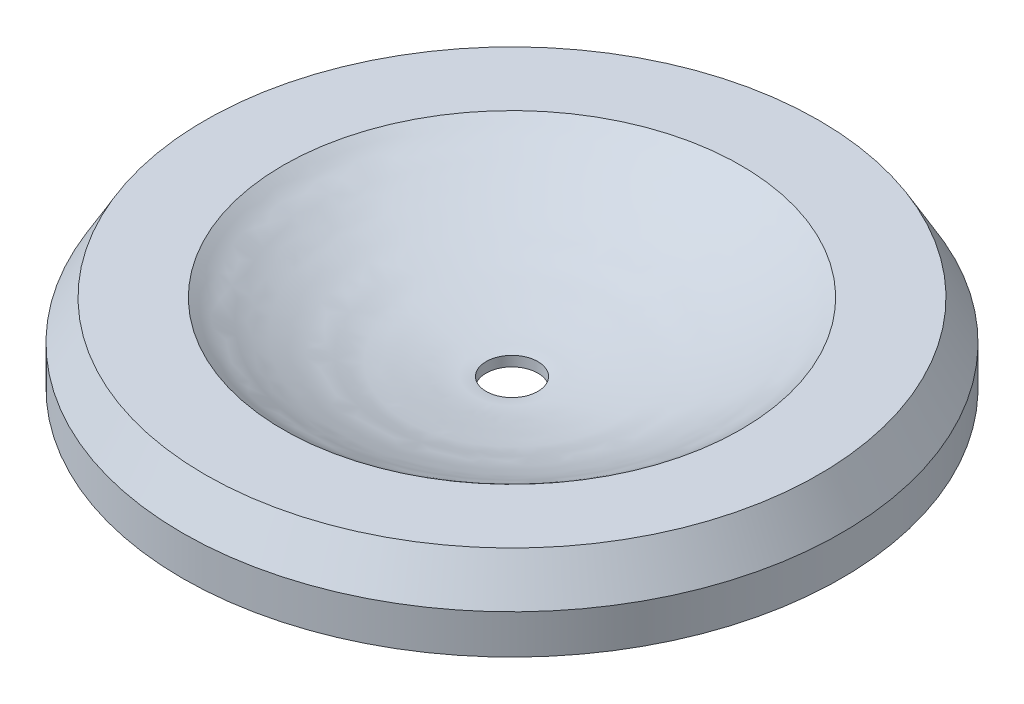
ISO-10303-21;
HEADER;
FILE_DESCRIPTION(('STEP AP214'),'2;1');
FILE_NAME('part.step','',(''),(''),'','','');
FILE_SCHEMA(('AUTOMOTIVE_DESIGN { 1 0 10303 214 1 1 1 1 }'));
ENDSEC;
DATA;
#1=APPLICATION_CONTEXT('core data for automotive mechanical design processes');
#2=APPLICATION_PROTOCOL_DEFINITION('international standard','automotive_design',2000,#1);
#3=PRODUCT_CONTEXT('',#1,'mechanical');
#4=PRODUCT('Part','Part','',(#3));
#5=PRODUCT_RELATED_PRODUCT_CATEGORY('part','',(#4));
#6=PRODUCT_DEFINITION_FORMATION('','',#4);
#7=PRODUCT_DEFINITION_CONTEXT('part definition',#1,'design');
#8=PRODUCT_DEFINITION('design','',#6,#7);
#9=PRODUCT_DEFINITION_SHAPE('','',#8);
#10=(LENGTH_UNIT() NAMED_UNIT(*) SI_UNIT(.MILLI.,.METRE.));
#11=(NAMED_UNIT(*) PLANE_ANGLE_UNIT() SI_UNIT($,.RADIAN.));
#12=(NAMED_UNIT(*) SI_UNIT($,.STERADIAN.) SOLID_ANGLE_UNIT());
#13=UNCERTAINTY_MEASURE_WITH_UNIT(LENGTH_MEASURE(1.E-05),#10,'distance_accuracy_value','');
#14=(GEOMETRIC_REPRESENTATION_CONTEXT(3) GLOBAL_UNCERTAINTY_ASSIGNED_CONTEXT((#13)) GLOBAL_UNIT_ASSIGNED_CONTEXT((#10,
#11,#12)) REPRESENTATION_CONTEXT('',''));
#15=CARTESIAN_POINT('',(0.,0.,0.));
#16=DIRECTION('',(0.,0.,1.));
#17=DIRECTION('',(1.,0.,0.));
#18=AXIS2_PLACEMENT_3D('',#15,#16,#17);
#19=CARTESIAN_POINT('',(0.,10.,0.));
#20=DIRECTION('',(0.,-1.,0.));
#21=DIRECTION('',(0.,0.,-1.));
#22=AXIS2_PLACEMENT_3D('',#19,#20,#21);
#23=CYLINDRICAL_SURFACE('',#22,42.);
#24=CARTESIAN_POINT('',(0.,4.99999999999993,0.));
#25=DIRECTION('',(0.,1.,0.));
#26=DIRECTION('',(0.,0.,1.));
#27=AXIS2_PLACEMENT_3D('',#24,#25,#26);
#28=CIRCLE('',#27,42.);
#29=CARTESIAN_POINT('',(0.,4.99999999999993,42.));
#30=VERTEX_POINT('',#29);
#31=EDGE_CURVE('E10',#30,#30,#28,.F.);
#32=ORIENTED_EDGE('',*,*,#31,.T.);
#33=EDGE_LOOP('',(#32));
#34=FACE_BOUND('',#33,.T.);
#35=CARTESIAN_POINT('',(0.,0.,0.));
#36=DIRECTION('',(0.,1.,0.));
#37=DIRECTION('',(0.,0.,1.));
#38=AXIS2_PLACEMENT_3D('',#35,#36,#37);
#39=CIRCLE('',#38,42.);
#40=CARTESIAN_POINT('',(0.,0.,42.));
#41=VERTEX_POINT('',#40);
#42=EDGE_CURVE('E45',#41,#41,#39,.T.);
#43=ORIENTED_EDGE('',*,*,#42,.T.);
#44=EDGE_LOOP('',(#43));
#45=FACE_BOUND('',#44,.T.);
#46=ADVANCED_FACE('F33',(#34,#45),#23,.T.);
#47=CARTESIAN_POINT('',(0.,10.,0.));
#48=DIRECTION('',(0.,1.,0.));
#49=DIRECTION('',(0.,0.,1.));
#50=AXIS2_PLACEMENT_3D('',#47,#48,#49);
#51=PLANE('',#50);
#52=CARTESIAN_POINT('',(0.,10.,0.));
#53=DIRECTION('',(0.,1.,0.));
#54=DIRECTION('',(0.,0.,1.));
#55=AXIS2_PLACEMENT_3D('',#52,#53,#54);
#56=CIRCLE('',#55,39.1132486540519);
#57=CARTESIAN_POINT('',(0.,10.,39.1132486540519));
#58=VERTEX_POINT('',#57);
#59=EDGE_CURVE('E41',#58,#58,#56,.T.);
#60=ORIENTED_EDGE('',*,*,#59,.T.);
#61=EDGE_LOOP('',(#60));
#62=FACE_BOUND('',#61,.T.);
#63=CARTESIAN_POINT('',(0.,9.99999999999999,0.));
#64=DIRECTION('',(0.,1.,0.));
#65=DIRECTION('',(-1.,0.,0.));
#66=AXIS2_PLACEMENT_3D('',#63,#64,#65);
#67=CIRCLE('',#66,29.1693782112261);
#68=CARTESIAN_POINT('',(-29.1693782112261,10.,0.));
#69=VERTEX_POINT('',#68);
#70=EDGE_CURVE('E49',#69,#69,#67,.F.);
#71=ORIENTED_EDGE('',*,*,#70,.T.);
#72=EDGE_LOOP('',(#71));
#73=FACE_BOUND('',#72,.T.);
#74=ADVANCED_FACE('F72',(#62,#73),#51,.T.);
#75=CARTESIAN_POINT('',(0.,0.,0.));
#76=DIRECTION('',(0.,1.,0.));
#77=DIRECTION('',(0.,0.,1.));
#78=AXIS2_PLACEMENT_3D('',#75,#76,#77);
#79=PLANE('',#78);
#80=CARTESIAN_POINT('',(0.,0.,0.));
#81=DIRECTION('',(0.,1.,0.));
#82=DIRECTION('',(-1.,0.,0.));
#83=AXIS2_PLACEMENT_3D('',#80,#81,#82);
#84=CIRCLE('',#83,3.29680710935442);
#85=CARTESIAN_POINT('',(-3.29680710935442,0.,0.));
#86=VERTEX_POINT('',#85);
#87=EDGE_CURVE('E53',#86,#86,#84,.T.);
#88=ORIENTED_EDGE('',*,*,#87,.T.);
#89=EDGE_LOOP('',(#88));
#90=FACE_BOUND('',#89,.T.);
#91=ORIENTED_EDGE('',*,*,#42,.F.);
#92=EDGE_LOOP('',(#91));
#93=FACE_BOUND('',#92,.T.);
#94=ADVANCED_FACE('F70',(#90,#93),#79,.F.);
#95=CARTESIAN_POINT('',(-2.57358630823547,1.27799623838654,-2.06048310605862));
#96=CARTESIAN_POINT('',(-3.27643623372604,1.43836563503083,-2.62320384829042));
#97=CARTESIAN_POINT('',(-4.44883401568342,1.46203955475199,-3.56185735898619));
#98=CARTESIAN_POINT('',(-6.00577396700348,1.84830519377102,-4.80838577599592));
#99=CARTESIAN_POINT('',(-7.23816893442391,2.12167456238885,-5.79507466310867));
#100=CARTESIAN_POINT('',(-8.39231098917471,2.42422619072472,-6.71911214271287));
#101=CARTESIAN_POINT('',(-9.50934707335027,2.72027836686267,-7.61344157434544));
#102=CARTESIAN_POINT('',(-10.645568912355,2.96497586778224,-8.52313164244705));
#103=CARTESIAN_POINT('',(-11.6035510600601,3.36633012897103,-9.29011817207527));
#104=CARTESIAN_POINT('',(-12.4209901271405,3.71176368418763,-9.94458209370927));
#105=CARTESIAN_POINT('',(-13.1223955629924,4.02887794065657,-10.5061463382989));
#106=CARTESIAN_POINT('',(-13.8435874351532,4.26305197707871,-11.0835521412669));
#107=CARTESIAN_POINT('',(-14.7054418299532,4.63636263176614,-11.7735761807503));
#108=CARTESIAN_POINT('',(-15.5587157464203,5.08450316446027,-12.4567304562043));
#109=CARTESIAN_POINT('',(-16.446771011316,5.5831497008863,-13.1677316239944));
#110=CARTESIAN_POINT('',(-17.283892551214,6.01529699993478,-13.8379538680116));
#111=CARTESIAN_POINT('',(-18.1227836492463,6.59235716988515,-14.5095928683386));
#112=CARTESIAN_POINT('',(-19.0763282769507,7.16167742089346,-15.2730265989155));
#113=CARTESIAN_POINT('',(-20.0436130149423,7.92615423130263,-16.0474610350182));
#114=CARTESIAN_POINT('',(-21.1601903307377,8.5261989919993,-16.9414231642239));
#115=CARTESIAN_POINT('',(-22.1947085873493,9.49476659639886,-17.7696865816334));
#116=CARTESIAN_POINT('',(-23.2098135144548,10.3841134784087,-18.5824071601058));
#117=CARTESIAN_POINT('',(-24.2447808653974,11.3479711523174,-19.4110301346357));
#118=CARTESIAN_POINT('',(-25.1331132524407,12.4198778791561,-20.1222531739447));
#119=CARTESIAN_POINT('',(-26.024478224171,13.4276483653082,-20.8359041829299));
#120=CARTESIAN_POINT('',(-26.8957327011742,14.3133850723894,-21.5334541835646));
#121=CARTESIAN_POINT('',(-27.6261322601007,15.3913232652355,-22.1182319106705));
#122=CARTESIAN_POINT('',(-28.4990953849801,16.1830858191755,-22.8171499012077));
#123=CARTESIAN_POINT('',(-29.1129608364273,17.2571571279485,-23.3086272563881));
#124=CARTESIAN_POINT('',(-29.7601673046513,18.1542127435183,-23.8267983352597));
#125=CARTESIAN_POINT('',(-30.3702648752872,19.181867225218,-24.3152590227136));
#126=CARTESIAN_POINT('',(-30.8133742130396,20.6430855807221,-24.6700243949313));
#127=CARTESIAN_POINT('',(-31.4417230199709,21.5439557141428,-25.1730975179313));
#128=CARTESIAN_POINT('',(-31.3305831370689,22.3488712771421,-25.0841159087286));
#129=B_SPLINE_CURVE_WITH_KNOTS('',3,(#95,#96,#97,#98,#99,#100,#101,#102,#103,#104,#105,#106,
#107,#108,#109,#110,#111,#112,#113,#114,#115,#116,#117,#118,#119,#120,#121,#122,#123,#124,#125,
#126,#127,#128),.UNSPECIFIED.,.F.,.F.,(4,1,1,1,1,1,1,1,1,1,1,1,1,1,1,1,1,1,1,1,1,1,1,1,1,1,1,1,
1,1,1,4),(0.,0.0615848644268745,0.100794932353676,0.136830734936231,0.169700167196271,
0.202568950002438,0.235437770861158,0.269088287988468,0.289472528241397,0.309858244293199,
0.333318893762607,0.353706297975795,0.388422523153927,0.412964694721672,0.437513727289155,
0.466339542289087,0.495168076467247,0.528353593993954,0.564387378827147,0.599250152815559,
0.63859311596508,0.670823766800798,0.709635235111035,0.743897497788843,0.773611536743798,
0.805518573365873,0.839782543764674,0.864952923184065,0.894669657821522,0.92239475175108,
0.951224043651229,1.),.UNSPECIFIED.);
#130=CARTESIAN_POINT('',(0.,1.27799623838654,0.));
#131=DIRECTION('',(0.,1.,0.));
#132=AXIS1_PLACEMENT('',#130,#131);
#133=SURFACE_OF_REVOLUTION('',#129,#132);
#134=ORIENTED_EDGE('',*,*,#70,.F.);
#135=EDGE_LOOP('',(#134));
#136=FACE_BOUND('',#135,.T.);
#137=CARTESIAN_POINT('',(0.,1.27799623838654,0.));
#138=DIRECTION('',(0.,1.,0.));
#139=DIRECTION('',(-1.,0.,0.));
#140=AXIS2_PLACEMENT_3D('',#137,#138,#139);
#141=CIRCLE('',#140,3.29680710935442);
#142=CARTESIAN_POINT('',(-3.29680710935442,1.27799623838654,0.));
#143=VERTEX_POINT('',#142);
#144=EDGE_CURVE('E59',#143,#143,#141,.T.);
#145=ORIENTED_EDGE('',*,*,#144,.F.);
#146=EDGE_LOOP('',(#145));
#147=FACE_BOUND('',#146,.T.);
#148=ADVANCED_FACE('F65',(#136,#147),#133,.F.);
#149=CARTESIAN_POINT('',(0.,0.,0.));
#150=DIRECTION('',(0.,1.,0.));
#151=DIRECTION('',(-1.,0.,0.));
#152=AXIS2_PLACEMENT_3D('',#149,#150,#151);
#153=CYLINDRICAL_SURFACE('',#152,3.29680710935442);
#154=ORIENTED_EDGE('',*,*,#87,.F.);
#155=EDGE_LOOP('',(#154));
#156=FACE_BOUND('',#155,.T.);
#157=ORIENTED_EDGE('',*,*,#144,.T.);
#158=EDGE_LOOP('',(#157));
#159=FACE_BOUND('',#158,.T.);
#160=ADVANCED_FACE('F69',(#156,#159),#153,.F.);
#161=CARTESIAN_POINT('',(0.,10.,0.));
#162=DIRECTION('',(0.,-1.,0.));
#163=DIRECTION('',(0.,0.,-1.));
#164=AXIS2_PLACEMENT_3D('',#161,#162,#163);
#165=CONICAL_SURFACE('',#164,39.1132486540519,0.523598775598296);
#166=ORIENTED_EDGE('',*,*,#31,.F.);
#167=EDGE_LOOP('',(#166));
#168=FACE_BOUND('',#167,.T.);
#169=ORIENTED_EDGE('',*,*,#59,.F.);
#170=EDGE_LOOP('',(#169));
#171=FACE_BOUND('',#170,.T.);
#172=ADVANCED_FACE('F36',(#168,#171),#165,.T.);
#173=CLOSED_SHELL('',(#46,#74,#94,#148,#160,#172));
#174=MANIFOLD_SOLID_BREP('B2',#173);
#175=ADVANCED_BREP_SHAPE_REPRESENTATION('',(#18,#174),#14);
#176=SHAPE_DEFINITION_REPRESENTATION(#9,#175);
ENDSEC;
END-ISO-10303-21;
